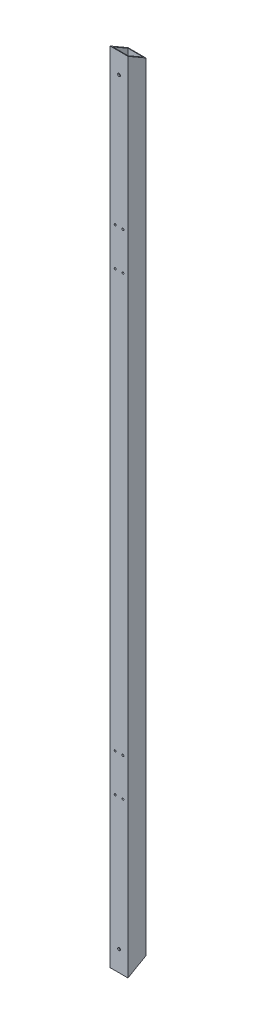
ISO-10303-21;
HEADER;
FILE_DESCRIPTION(('STEP AP214'),'2;1');
FILE_NAME('part.step','',(''),(''),'','','');
FILE_SCHEMA(('AUTOMOTIVE_DESIGN { 1 0 10303 214 1 1 1 1 }'));
ENDSEC;
DATA;
#1=APPLICATION_CONTEXT('core data for automotive mechanical design processes');
#2=APPLICATION_PROTOCOL_DEFINITION('international standard','automotive_design',2000,#1);
#3=PRODUCT_CONTEXT('',#1,'mechanical');
#4=PRODUCT('Part','Part','',(#3));
#5=PRODUCT_RELATED_PRODUCT_CATEGORY('part','',(#4));
#6=PRODUCT_DEFINITION_FORMATION('','',#4);
#7=PRODUCT_DEFINITION_CONTEXT('part definition',#1,'design');
#8=PRODUCT_DEFINITION('design','',#6,#7);
#9=PRODUCT_DEFINITION_SHAPE('','',#8);
#10=(LENGTH_UNIT() NAMED_UNIT(*) SI_UNIT(.MILLI.,.METRE.));
#11=(NAMED_UNIT(*) PLANE_ANGLE_UNIT() SI_UNIT($,.RADIAN.));
#12=(NAMED_UNIT(*) SI_UNIT($,.STERADIAN.) SOLID_ANGLE_UNIT());
#13=UNCERTAINTY_MEASURE_WITH_UNIT(LENGTH_MEASURE(1.E-05),#10,'distance_accuracy_value','');
#14=(GEOMETRIC_REPRESENTATION_CONTEXT(3) GLOBAL_UNCERTAINTY_ASSIGNED_CONTEXT((#13)) GLOBAL_UNIT_ASSIGNED_CONTEXT((#10,
#11,#12)) REPRESENTATION_CONTEXT('',''));
#15=CARTESIAN_POINT('',(0.,0.,0.));
#16=DIRECTION('',(0.,0.,1.));
#17=DIRECTION('',(1.,0.,0.));
#18=AXIS2_PLACEMENT_3D('',#15,#16,#17);
#19=CARTESIAN_POINT('',(-19.0500000000003,-990.092,3.175));
#20=DIRECTION('',(0.,0.,-1.));
#21=DIRECTION('',(-1.00000000000001,0.,0.));
#22=AXIS2_PLACEMENT_3D('',#19,#20,#21);
#23=PLANE('',#22);
#24=CARTESIAN_POINT('',(-9.52500000000015,-612.1654,3.175));
#25=DIRECTION('',(0.,0.,-1.));
#26=DIRECTION('',(-1.00000000000001,0.,0.));
#27=AXIS2_PLACEMENT_3D('',#24,#25,#26);
#28=CIRCLE('',#27,2.45744999999999);
#29=CARTESIAN_POINT('',(-11.9824500000002,-612.1654,3.175));
#30=VERTEX_POINT('',#29);
#31=EDGE_CURVE('E760',#30,#30,#28,.T.);
#32=ORIENTED_EDGE('',*,*,#31,.T.);
#33=EDGE_LOOP('',(#32));
#34=FACE_BOUND('',#33,.T.);
#35=CARTESIAN_POINT('',(9.52500000000005,-612.1654,3.17499999999987));
#36=DIRECTION('',(0.,0.,-1.));
#37=DIRECTION('',(-1.00000000000001,0.,0.));
#38=AXIS2_PLACEMENT_3D('',#35,#36,#37);
#39=CIRCLE('',#38,2.45744999999999);
#40=CARTESIAN_POINT('',(7.06755000000004,-612.1654,3.17499999999987));
#41=VERTEX_POINT('',#40);
#42=EDGE_CURVE('E746',#41,#41,#39,.T.);
#43=ORIENTED_EDGE('',*,*,#42,.T.);
#44=EDGE_LOOP('',(#43));
#45=FACE_BOUND('',#44,.T.);
#46=CARTESIAN_POINT('',(-9.52500000000009,-518.1346,3.175));
#47=DIRECTION('',(0.,0.,-1.));
#48=DIRECTION('',(-1.00000000000001,0.,0.));
#49=AXIS2_PLACEMENT_3D('',#46,#47,#48);
#50=CIRCLE('',#49,2.45744999999999);
#51=CARTESIAN_POINT('',(-11.9824500000001,-518.1346,3.175));
#52=VERTEX_POINT('',#51);
#53=EDGE_CURVE('E732',#52,#52,#50,.T.);
#54=ORIENTED_EDGE('',*,*,#53,.T.);
#55=EDGE_LOOP('',(#54));
#56=FACE_BOUND('',#55,.T.);
#57=CARTESIAN_POINT('',(9.52500000000005,-518.1346,3.17499999999987));
#58=DIRECTION('',(0.,0.,-1.));
#59=DIRECTION('',(-1.00000000000001,0.,0.));
#60=AXIS2_PLACEMENT_3D('',#57,#58,#59);
#61=CIRCLE('',#60,2.45744999999999);
#62=CARTESIAN_POINT('',(7.06755000000004,-518.1346,3.17499999999987));
#63=VERTEX_POINT('',#62);
#64=EDGE_CURVE('E718',#63,#63,#61,.T.);
#65=ORIENTED_EDGE('',*,*,#64,.T.);
#66=EDGE_LOOP('',(#65));
#67=FACE_BOUND('',#66,.T.);
#68=CARTESIAN_POINT('',(-9.52500000000009,518.1346,3.175));
#69=DIRECTION('',(0.,0.,-1.));
#70=DIRECTION('',(-1.00000000000001,0.,0.));
#71=AXIS2_PLACEMENT_3D('',#68,#69,#70);
#72=CIRCLE('',#71,2.45744999999999);
#73=CARTESIAN_POINT('',(-11.9824500000001,518.1346,3.175));
#74=VERTEX_POINT('',#73);
#75=EDGE_CURVE('E704',#74,#74,#72,.T.);
#76=ORIENTED_EDGE('',*,*,#75,.T.);
#77=EDGE_LOOP('',(#76));
#78=FACE_BOUND('',#77,.T.);
#79=CARTESIAN_POINT('',(9.52500000000002,518.1346,3.17499999999987));
#80=DIRECTION('',(0.,0.,-1.));
#81=DIRECTION('',(-1.00000000000001,0.,0.));
#82=AXIS2_PLACEMENT_3D('',#79,#80,#81);
#83=CIRCLE('',#82,2.45744999999999);
#84=CARTESIAN_POINT('',(7.06755000000001,518.1346,3.17499999999987));
#85=VERTEX_POINT('',#84);
#86=EDGE_CURVE('E690',#85,#85,#83,.T.);
#87=ORIENTED_EDGE('',*,*,#86,.T.);
#88=EDGE_LOOP('',(#87));
#89=FACE_BOUND('',#88,.T.);
#90=CARTESIAN_POINT('',(-9.52500000000015,612.1654,3.175));
#91=DIRECTION('',(0.,0.,-1.));
#92=DIRECTION('',(-1.00000000000001,0.,0.));
#93=AXIS2_PLACEMENT_3D('',#90,#91,#92);
#94=CIRCLE('',#93,2.45744999999999);
#95=CARTESIAN_POINT('',(-11.9824500000002,612.1654,3.175));
#96=VERTEX_POINT('',#95);
#97=EDGE_CURVE('E676',#96,#96,#94,.T.);
#98=ORIENTED_EDGE('',*,*,#97,.T.);
#99=EDGE_LOOP('',(#98));
#100=FACE_BOUND('',#99,.T.);
#101=CARTESIAN_POINT('',(9.52500000000002,612.1654,3.17499999999987));
#102=DIRECTION('',(0.,0.,-1.));
#103=DIRECTION('',(-1.00000000000001,0.,0.));
#104=AXIS2_PLACEMENT_3D('',#101,#102,#103);
#105=CIRCLE('',#104,2.45744999999999);
#106=CARTESIAN_POINT('',(7.06755000000001,612.1654,3.17499999999987));
#107=VERTEX_POINT('',#106);
#108=EDGE_CURVE('E662',#107,#107,#105,.T.);
#109=ORIENTED_EDGE('',*,*,#108,.T.);
#110=EDGE_LOOP('',(#109));
#111=FACE_BOUND('',#110,.T.);
#112=CARTESIAN_POINT('',(-3.60822483003176E-13,939.037999999999,3.175));
#113=DIRECTION('',(0.,0.,-1.));
#114=DIRECTION('',(-1.00000000000001,0.,0.));
#115=AXIS2_PLACEMENT_3D('',#112,#113,#114);
#116=CIRCLE('',#115,3.37343749999996);
#117=CARTESIAN_POINT('',(-3.37343750000035,939.037999999999,3.175));
#118=VERTEX_POINT('',#117);
#119=EDGE_CURVE('E205',#118,#118,#116,.T.);
#120=ORIENTED_EDGE('',*,*,#119,.T.);
#121=EDGE_LOOP('',(#120));
#122=FACE_BOUND('',#121,.T.);
#123=CARTESIAN_POINT('',(-3.60822483003176E-13,-939.038,3.175));
#124=DIRECTION('',(0.,0.,-1.));
#125=DIRECTION('',(-1.00000000000001,0.,0.));
#126=AXIS2_PLACEMENT_3D('',#123,#124,#125);
#127=CIRCLE('',#126,3.37343749999996);
#128=CARTESIAN_POINT('',(-3.37343750000035,-939.038,3.175));
#129=VERTEX_POINT('',#128);
#130=EDGE_CURVE('E225',#129,#129,#127,.T.);
#131=ORIENTED_EDGE('',*,*,#130,.T.);
#132=EDGE_LOOP('',(#131));
#133=FACE_BOUND('',#132,.T.);
#134=DIRECTION('',(0.,1.,0.));
#135=VECTOR('',#134,1.);
#136=CARTESIAN_POINT('',(19.05,-990.092,3.175));
#137=LINE('',#136,#135);
#138=CARTESIAN_POINT('',(19.05,-966.261867639198,3.175));
#139=VERTEX_POINT('',#138);
#140=CARTESIAN_POINT('',(19.0500000000001,966.261867639197,3.175));
#141=VERTEX_POINT('',#140);
#142=EDGE_CURVE('E164',#139,#141,#137,.T.);
#143=ORIENTED_EDGE('',*,*,#142,.T.);
#144=DIRECTION('',(-1.00000000000001,0.,0.));
#145=VECTOR('',#144,1.);
#146=CARTESIAN_POINT('',(-19.0500000000004,966.261867639197,3.175));
#147=LINE('',#146,#145);
#148=CARTESIAN_POINT('',(-19.0500000000002,966.261867639197,3.175));
#149=VERTEX_POINT('',#148);
#150=EDGE_CURVE('E11',#141,#149,#147,.T.);
#151=ORIENTED_EDGE('',*,*,#150,.T.);
#152=DIRECTION('',(0.,1.,0.));
#153=VECTOR('',#152,1.);
#154=CARTESIAN_POINT('',(-19.0500000000003,-990.092,3.175));
#155=LINE('',#154,#153);
#156=CARTESIAN_POINT('',(-19.0500000000003,-966.261867639198,3.175));
#157=VERTEX_POINT('',#156);
#158=EDGE_CURVE('E166',#157,#149,#155,.T.);
#159=ORIENTED_EDGE('',*,*,#158,.F.);
#160=DIRECTION('',(1.00000000000001,0.,0.));
#161=VECTOR('',#160,1.);
#162=CARTESIAN_POINT('',(-19.0500000000003,-966.261867639198,3.175));
#163=LINE('',#162,#161);
#164=EDGE_CURVE('E53',#157,#139,#163,.T.);
#165=ORIENTED_EDGE('',*,*,#164,.T.);
#166=EDGE_LOOP('',(#143,#151,#159,#165));
#167=FACE_BOUND('',#166,.T.);
#168=ADVANCED_FACE('F44',(#34,#45,#56,#67,#78,#89,#100,#111,#122,#133,#167),#23,.F.);
#169=CARTESIAN_POINT('',(-19.0500000000003,-990.092,3.175));
#170=DIRECTION('',(-1.00000000000001,0.,0.));
#171=DIRECTION('',(0.,0.,1.));
#172=AXIS2_PLACEMENT_3D('',#169,#170,#171);
#173=PLANE('',#172);
#174=ORIENTED_EDGE('',*,*,#158,.T.);
#175=DIRECTION('',(0.,0.500000000000007,0.866025403784435));
#176=VECTOR('',#175,1.);
#177=CARTESIAN_POINT('',(-19.0500000000003,477.173400729384,-843.95107408375));
#178=LINE('',#177,#176);
#179=CARTESIAN_POINT('',(-19.0500000000002,988.258912895322,41.2749999999999));
#180=VERTEX_POINT('',#179);
#181=EDGE_CURVE('E238',#149,#180,#178,.T.);
#182=ORIENTED_EDGE('',*,*,#181,.T.);
#183=DIRECTION('',(0.,1.,0.));
#184=VECTOR('',#183,1.);
#185=CARTESIAN_POINT('',(-19.0500000000002,-990.092,41.275));
#186=LINE('',#185,#184);
#187=CARTESIAN_POINT('',(-19.0500000000002,-988.258912895323,41.275));
#188=VERTEX_POINT('',#187);
#189=EDGE_CURVE('E182',#188,#180,#186,.T.);
#190=ORIENTED_EDGE('',*,*,#189,.F.);
#191=DIRECTION('',(0.,0.500000000000004,-0.866025403784437));
#192=VECTOR('',#191,1.);
#193=CARTESIAN_POINT('',(-19.0500000000001,-972.219400729399,13.4937500000002));
#194=LINE('',#193,#192);
#195=EDGE_CURVE('E216',#188,#157,#194,.T.);
#196=ORIENTED_EDGE('',*,*,#195,.T.);
#197=EDGE_LOOP('',(#174,#182,#190,#196));
#198=FACE_BOUND('',#197,.T.);
#199=ADVANCED_FACE('F278',(#198),#173,.F.);
#200=CARTESIAN_POINT('',(-19.0500000000002,-990.092,41.275));
#201=DIRECTION('',(0.,0.,1.));
#202=DIRECTION('',(1.00000000000001,0.,0.));
#203=AXIS2_PLACEMENT_3D('',#200,#201,#202);
#204=PLANE('',#203);
#205=CARTESIAN_POINT('',(-9.5250000000002,-612.1654,41.275));
#206=DIRECTION('',(0.,0.,1.));
#207=DIRECTION('',(1.00000000000001,0.,0.));
#208=AXIS2_PLACEMENT_3D('',#205,#206,#207);
#209=CIRCLE('',#208,2.45744999999999);
#210=CARTESIAN_POINT('',(-7.06755000000019,-612.1654,41.275));
#211=VERTEX_POINT('',#210);
#212=EDGE_CURVE('E619',#211,#211,#209,.T.);
#213=ORIENTED_EDGE('',*,*,#212,.T.);
#214=EDGE_LOOP('',(#213));
#215=FACE_BOUND('',#214,.T.);
#216=CARTESIAN_POINT('',(9.52500000000005,-612.1654,41.2749999999999));
#217=DIRECTION('',(0.,0.,1.));
#218=DIRECTION('',(1.00000000000001,0.,0.));
#219=AXIS2_PLACEMENT_3D('',#216,#217,#218);
#220=CIRCLE('',#219,2.45744999999999);
#221=CARTESIAN_POINT('',(11.9824500000001,-612.1654,41.2749999999999));
#222=VERTEX_POINT('',#221);
#223=EDGE_CURVE('E623',#222,#222,#220,.T.);
#224=ORIENTED_EDGE('',*,*,#223,.T.);
#225=EDGE_LOOP('',(#224));
#226=FACE_BOUND('',#225,.T.);
#227=CARTESIAN_POINT('',(-9.52500000000014,-518.1346,41.275));
#228=DIRECTION('',(0.,0.,1.));
#229=DIRECTION('',(1.00000000000001,0.,0.));
#230=AXIS2_PLACEMENT_3D('',#227,#228,#229);
#231=CIRCLE('',#230,2.45744999999999);
#232=CARTESIAN_POINT('',(-7.06755000000013,-518.1346,41.275));
#233=VERTEX_POINT('',#232);
#234=EDGE_CURVE('E627',#233,#233,#231,.T.);
#235=ORIENTED_EDGE('',*,*,#234,.T.);
#236=EDGE_LOOP('',(#235));
#237=FACE_BOUND('',#236,.T.);
#238=CARTESIAN_POINT('',(9.52500000000005,-518.1346,41.2749999999999));
#239=DIRECTION('',(0.,0.,1.));
#240=DIRECTION('',(1.00000000000001,0.,0.));
#241=AXIS2_PLACEMENT_3D('',#238,#239,#240);
#242=CIRCLE('',#241,2.45744999999999);
#243=CARTESIAN_POINT('',(11.9824500000001,-518.1346,41.2749999999999));
#244=VERTEX_POINT('',#243);
#245=EDGE_CURVE('E631',#244,#244,#242,.T.);
#246=ORIENTED_EDGE('',*,*,#245,.T.);
#247=EDGE_LOOP('',(#246));
#248=FACE_BOUND('',#247,.T.);
#249=CARTESIAN_POINT('',(-9.52500000000015,518.1346,41.275));
#250=DIRECTION('',(0.,0.,1.));
#251=DIRECTION('',(1.00000000000001,0.,0.));
#252=AXIS2_PLACEMENT_3D('',#249,#250,#251);
#253=CIRCLE('',#252,2.45744999999999);
#254=CARTESIAN_POINT('',(-7.06755000000014,518.1346,41.275));
#255=VERTEX_POINT('',#254);
#256=EDGE_CURVE('E635',#255,#255,#253,.T.);
#257=ORIENTED_EDGE('',*,*,#256,.T.);
#258=EDGE_LOOP('',(#257));
#259=FACE_BOUND('',#258,.T.);
#260=CARTESIAN_POINT('',(9.52500000000002,518.1346,41.2749999999999));
#261=DIRECTION('',(0.,0.,1.));
#262=DIRECTION('',(1.00000000000001,0.,0.));
#263=AXIS2_PLACEMENT_3D('',#260,#261,#262);
#264=CIRCLE('',#263,2.45744999999999);
#265=CARTESIAN_POINT('',(11.98245,518.1346,41.2749999999999));
#266=VERTEX_POINT('',#265);
#267=EDGE_CURVE('E639',#266,#266,#264,.T.);
#268=ORIENTED_EDGE('',*,*,#267,.T.);
#269=EDGE_LOOP('',(#268));
#270=FACE_BOUND('',#269,.T.);
#271=CARTESIAN_POINT('',(-9.5250000000002,612.1654,41.275));
#272=DIRECTION('',(0.,0.,1.));
#273=DIRECTION('',(1.00000000000001,0.,0.));
#274=AXIS2_PLACEMENT_3D('',#271,#272,#273);
#275=CIRCLE('',#274,2.45744999999999);
#276=CARTESIAN_POINT('',(-7.06755000000019,612.1654,41.275));
#277=VERTEX_POINT('',#276);
#278=EDGE_CURVE('E643',#277,#277,#275,.T.);
#279=ORIENTED_EDGE('',*,*,#278,.T.);
#280=EDGE_LOOP('',(#279));
#281=FACE_BOUND('',#280,.T.);
#282=CARTESIAN_POINT('',(9.52500000000002,612.1654,41.2749999999999));
#283=DIRECTION('',(0.,0.,1.));
#284=DIRECTION('',(1.00000000000001,0.,0.));
#285=AXIS2_PLACEMENT_3D('',#282,#283,#284);
#286=CIRCLE('',#285,2.45744999999999);
#287=CARTESIAN_POINT('',(11.98245,612.1654,41.2749999999999));
#288=VERTEX_POINT('',#287);
#289=EDGE_CURVE('E647',#288,#288,#286,.T.);
#290=ORIENTED_EDGE('',*,*,#289,.T.);
#291=EDGE_LOOP('',(#290));
#292=FACE_BOUND('',#291,.T.);
#293=CARTESIAN_POINT('',(-3.60822483003176E-13,939.037999999999,41.275));
#294=DIRECTION('',(0.,0.,1.));
#295=DIRECTION('',(1.00000000000001,0.,0.));
#296=AXIS2_PLACEMENT_3D('',#293,#294,#295);
#297=CIRCLE('',#296,3.37343749999996);
#298=CARTESIAN_POINT('',(3.37343749999963,939.037999999999,41.275));
#299=VERTEX_POINT('',#298);
#300=EDGE_CURVE('E210',#299,#299,#297,.T.);
#301=ORIENTED_EDGE('',*,*,#300,.T.);
#302=EDGE_LOOP('',(#301));
#303=FACE_BOUND('',#302,.T.);
#304=CARTESIAN_POINT('',(-3.60822483003176E-13,-939.038,41.275));
#305=DIRECTION('',(0.,0.,1.));
#306=DIRECTION('',(1.00000000000001,0.,0.));
#307=AXIS2_PLACEMENT_3D('',#304,#305,#306);
#308=CIRCLE('',#307,3.37343749999996);
#309=CARTESIAN_POINT('',(3.37343749999963,-939.038,41.275));
#310=VERTEX_POINT('',#309);
#311=EDGE_CURVE('E199',#310,#310,#308,.T.);
#312=ORIENTED_EDGE('',*,*,#311,.T.);
#313=EDGE_LOOP('',(#312));
#314=FACE_BOUND('',#313,.T.);
#315=ORIENTED_EDGE('',*,*,#189,.T.);
#316=DIRECTION('',(1.00000000000001,0.,0.));
#317=VECTOR('',#316,1.);
#318=CARTESIAN_POINT('',(-19.0500000000004,988.258912895323,41.275));
#319=LINE('',#318,#317);
#320=CARTESIAN_POINT('',(19.0500000000001,988.258912895323,41.275));
#321=VERTEX_POINT('',#320);
#322=EDGE_CURVE('E185',#180,#321,#319,.T.);
#323=ORIENTED_EDGE('',*,*,#322,.T.);
#324=DIRECTION('',(0.,1.,0.));
#325=VECTOR('',#324,1.);
#326=CARTESIAN_POINT('',(19.0500000000001,-990.092,41.275));
#327=LINE('',#326,#325);
#328=CARTESIAN_POINT('',(19.0500000000001,-988.258912895323,41.275));
#329=VERTEX_POINT('',#328);
#330=EDGE_CURVE('E154',#329,#321,#327,.T.);
#331=ORIENTED_EDGE('',*,*,#330,.F.);
#332=DIRECTION('',(-1.00000000000001,0.,0.));
#333=VECTOR('',#332,1.);
#334=CARTESIAN_POINT('',(-19.0500000000002,-988.258912895323,41.275));
#335=LINE('',#334,#333);
#336=EDGE_CURVE('E266',#329,#188,#335,.T.);
#337=ORIENTED_EDGE('',*,*,#336,.T.);
#338=EDGE_LOOP('',(#315,#323,#331,#337));
#339=FACE_BOUND('',#338,.T.);
#340=ADVANCED_FACE('F276',(#215,#226,#237,#248,#259,#270,#281,#292,#303,#314,#339),#204,.F.);
#341=CARTESIAN_POINT('',(19.05,-990.092,3.175));
#342=DIRECTION('',(1.00000000000001,0.,0.));
#343=DIRECTION('',(0.,0.,-1.));
#344=AXIS2_PLACEMENT_3D('',#341,#342,#343);
#345=PLANE('',#344);
#346=ORIENTED_EDGE('',*,*,#330,.T.);
#347=DIRECTION('',(0.,-0.500000000000007,-0.866025403784435));
#348=VECTOR('',#347,1.);
#349=CARTESIAN_POINT('',(19.0499999999998,477.173400729384,-843.95107408375));
#350=LINE('',#349,#348);
#351=EDGE_CURVE('E176',#321,#141,#350,.T.);
#352=ORIENTED_EDGE('',*,*,#351,.T.);
#353=ORIENTED_EDGE('',*,*,#142,.F.);
#354=DIRECTION('',(0.,-0.500000000000004,0.866025403784437));
#355=VECTOR('',#354,1.);
#356=CARTESIAN_POINT('',(19.0500000000001,-972.219400729399,13.4937500000002));
#357=LINE('',#356,#355);
#358=EDGE_CURVE('E174',#139,#329,#357,.T.);
#359=ORIENTED_EDGE('',*,*,#358,.T.);
#360=EDGE_LOOP('',(#346,#352,#353,#359));
#361=FACE_BOUND('',#360,.T.);
#362=ADVANCED_FACE('F173',(#361),#345,.F.);
#363=CARTESIAN_POINT('',(-22.2250000000002,-990.092,44.45));
#364=DIRECTION('',(0.,0.866025403784437,0.500000000000004));
#365=DIRECTION('',(0.,-0.500000000000004,0.866025403784437));
#366=AXIS2_PLACEMENT_3D('',#363,#364,#365);
#367=PLANE('',#366);
#368=DIRECTION('',(0.,-0.500000000000004,0.866025403784436));
#369=VECTOR('',#368,1.);
#370=CARTESIAN_POINT('',(22.2250000000003,-990.092,44.45));
#371=LINE('',#370,#369);
#372=CARTESIAN_POINT('',(22.2250000000002,-964.428780534521,0.));
#373=VERTEX_POINT('',#372);
#374=CARTESIAN_POINT('',(22.2250000000003,-990.092,44.45));
#375=VERTEX_POINT('',#374);
#376=EDGE_CURVE('E209',#373,#375,#371,.T.);
#377=ORIENTED_EDGE('',*,*,#376,.T.);
#378=DIRECTION('',(1.00000000000001,0.,0.));
#379=VECTOR('',#378,1.);
#380=CARTESIAN_POINT('',(-22.225,-990.092,44.45));
#381=LINE('',#380,#379);
#382=CARTESIAN_POINT('',(-22.2250000000002,-990.092,44.45));
#383=VERTEX_POINT('',#382);
#384=EDGE_CURVE('E140',#383,#375,#381,.T.);
#385=ORIENTED_EDGE('',*,*,#384,.F.);
#386=DIRECTION('',(0.,-0.500000000000004,0.866025403784436));
#387=VECTOR('',#386,1.);
#388=CARTESIAN_POINT('',(-22.2250000000002,-990.092,44.45));
#389=LINE('',#388,#387);
#390=CARTESIAN_POINT('',(-22.225,-964.428780534521,0.));
#391=VERTEX_POINT('',#390);
#392=EDGE_CURVE('E60',#391,#383,#389,.T.);
#393=ORIENTED_EDGE('',*,*,#392,.F.);
#394=DIRECTION('',(1.00000000000001,0.,0.));
#395=VECTOR('',#394,1.);
#396=CARTESIAN_POINT('',(-22.2250000000002,-964.428780534521,0.));
#397=LINE('',#396,#395);
#398=EDGE_CURVE('E252',#391,#373,#397,.T.);
#399=ORIENTED_EDGE('',*,*,#398,.T.);
#400=EDGE_LOOP('',(#377,#385,#393,#399));
#401=FACE_BOUND('',#400,.T.);
#402=ORIENTED_EDGE('',*,*,#164,.F.);
#403=ORIENTED_EDGE('',*,*,#195,.F.);
#404=ORIENTED_EDGE('',*,*,#336,.F.);
#405=ORIENTED_EDGE('',*,*,#358,.F.);
#406=EDGE_LOOP('',(#402,#403,#404,#405));
#407=FACE_BOUND('',#406,.T.);
#408=ADVANCED_FACE('F280',(#401,#407),#367,.F.);
#409=CARTESIAN_POINT('',(-22.2250000000005,990.092,44.45));
#410=DIRECTION('',(0.,-0.866025403784435,0.500000000000007));
#411=DIRECTION('',(0.,-0.500000000000007,-0.866025403784435));
#412=AXIS2_PLACEMENT_3D('',#409,#410,#411);
#413=PLANE('',#412);
#414=DIRECTION('',(0.,-0.500000000000007,-0.866025403784435));
#415=VECTOR('',#414,1.);
#416=CARTESIAN_POINT('',(22.225,990.092,44.45));
#417=LINE('',#416,#415);
#418=CARTESIAN_POINT('',(22.225,990.092,44.45));
#419=VERTEX_POINT('',#418);
#420=CARTESIAN_POINT('',(22.2250000000001,964.42878053452,0.));
#421=VERTEX_POINT('',#420);
#422=EDGE_CURVE('E71',#419,#421,#417,.T.);
#423=ORIENTED_EDGE('',*,*,#422,.T.);
#424=DIRECTION('',(1.00000000000001,0.,0.));
#425=VECTOR('',#424,1.);
#426=CARTESIAN_POINT('',(-22.2250000000004,964.42878053452,0.));
#427=LINE('',#426,#425);
#428=CARTESIAN_POINT('',(-22.2250000000004,964.42878053452,0.));
#429=VERTEX_POINT('',#428);
#430=EDGE_CURVE('E121',#429,#421,#427,.T.);
#431=ORIENTED_EDGE('',*,*,#430,.F.);
#432=DIRECTION('',(0.,-0.500000000000007,-0.866025403784435));
#433=VECTOR('',#432,1.);
#434=CARTESIAN_POINT('',(-22.2250000000005,990.092,44.45));
#435=LINE('',#434,#433);
#436=CARTESIAN_POINT('',(-22.2250000000005,990.092,44.45));
#437=VERTEX_POINT('',#436);
#438=EDGE_CURVE('E116',#437,#429,#435,.T.);
#439=ORIENTED_EDGE('',*,*,#438,.F.);
#440=DIRECTION('',(-1.00000000000001,0.,0.));
#441=VECTOR('',#440,1.);
#442=CARTESIAN_POINT('',(-22.2250000000002,990.092,44.45));
#443=LINE('',#442,#441);
#444=EDGE_CURVE('E120',#419,#437,#443,.T.);
#445=ORIENTED_EDGE('',*,*,#444,.F.);
#446=EDGE_LOOP('',(#423,#431,#439,#445));
#447=FACE_BOUND('',#446,.T.);
#448=ORIENTED_EDGE('',*,*,#322,.F.);
#449=ORIENTED_EDGE('',*,*,#181,.F.);
#450=ORIENTED_EDGE('',*,*,#150,.F.);
#451=ORIENTED_EDGE('',*,*,#351,.F.);
#452=EDGE_LOOP('',(#448,#449,#450,#451));
#453=FACE_BOUND('',#452,.T.);
#454=ADVANCED_FACE('F118',(#447,#453),#413,.F.);
#455=CARTESIAN_POINT('',(22.225,990.092,44.45));
#456=DIRECTION('',(-1.00000000000001,0.,0.));
#457=DIRECTION('',(0.,-1.,0.));
#458=AXIS2_PLACEMENT_3D('',#455,#456,#457);
#459=PLANE('',#458);
#460=DIRECTION('',(0.,1.,0.));
#461=VECTOR('',#460,1.);
#462=CARTESIAN_POINT('',(22.2250000000001,990.092,0.));
#463=LINE('',#462,#461);
#464=EDGE_CURVE('E149',#373,#421,#463,.T.);
#465=ORIENTED_EDGE('',*,*,#464,.T.);
#466=ORIENTED_EDGE('',*,*,#422,.F.);
#467=DIRECTION('',(0.,1.,0.));
#468=VECTOR('',#467,1.);
#469=CARTESIAN_POINT('',(22.225,990.092,44.45));
#470=LINE('',#469,#468);
#471=EDGE_CURVE('E135',#375,#419,#470,.T.);
#472=ORIENTED_EDGE('',*,*,#471,.F.);
#473=ORIENTED_EDGE('',*,*,#376,.F.);
#474=EDGE_LOOP('',(#465,#466,#472,#473));
#475=FACE_BOUND('',#474,.T.);
#476=ADVANCED_FACE('F46',(#475),#459,.F.);
#477=CARTESIAN_POINT('',(-22.2250000000002,990.092,44.45));
#478=DIRECTION('',(1.00000000000001,0.,0.));
#479=DIRECTION('',(0.,1.,0.));
#480=AXIS2_PLACEMENT_3D('',#477,#478,#479);
#481=PLANE('',#480);
#482=DIRECTION('',(0.,-1.,0.));
#483=VECTOR('',#482,1.);
#484=CARTESIAN_POINT('',(-22.2250000000002,990.092,44.45));
#485=LINE('',#484,#483);
#486=EDGE_CURVE('E133',#437,#383,#485,.T.);
#487=ORIENTED_EDGE('',*,*,#486,.F.);
#488=ORIENTED_EDGE('',*,*,#438,.T.);
#489=DIRECTION('',(0.,-1.,0.));
#490=VECTOR('',#489,1.);
#491=CARTESIAN_POINT('',(-22.2250000000001,990.092,0.));
#492=LINE('',#491,#490);
#493=EDGE_CURVE('E153',#429,#391,#492,.T.);
#494=ORIENTED_EDGE('',*,*,#493,.T.);
#495=ORIENTED_EDGE('',*,*,#392,.T.);
#496=EDGE_LOOP('',(#487,#488,#494,#495));
#497=FACE_BOUND('',#496,.T.);
#498=ADVANCED_FACE('F138',(#497),#481,.F.);
#499=CARTESIAN_POINT('',(0.,0.,44.45));
#500=DIRECTION('',(0.,0.,1.));
#501=DIRECTION('',(1.00000000000001,0.,0.));
#502=AXIS2_PLACEMENT_3D('',#499,#500,#501);
#503=PLANE('',#502);
#504=CARTESIAN_POINT('',(-9.52500000000014,-612.1654,44.45));
#505=DIRECTION('',(0.,0.,1.));
#506=DIRECTION('',(1.00000000000001,0.,0.));
#507=AXIS2_PLACEMENT_3D('',#504,#505,#506);
#508=CIRCLE('',#507,2.45744999999999);
#509=CARTESIAN_POINT('',(-7.06755000000014,-612.1654,44.45));
#510=VERTEX_POINT('',#509);
#511=EDGE_CURVE('E769',#510,#510,#508,.T.);
#512=ORIENTED_EDGE('',*,*,#511,.F.);
#513=EDGE_LOOP('',(#512));
#514=FACE_BOUND('',#513,.T.);
#515=CARTESIAN_POINT('',(9.52500000000005,-612.1654,44.4499999999999));
#516=DIRECTION('',(0.,0.,1.));
#517=DIRECTION('',(1.00000000000001,0.,0.));
#518=AXIS2_PLACEMENT_3D('',#515,#516,#517);
#519=CIRCLE('',#518,2.45744999999999);
#520=CARTESIAN_POINT('',(11.9824500000001,-612.1654,44.4499999999999));
#521=VERTEX_POINT('',#520);
#522=EDGE_CURVE('E756',#521,#521,#519,.T.);
#523=ORIENTED_EDGE('',*,*,#522,.F.);
#524=EDGE_LOOP('',(#523));
#525=FACE_BOUND('',#524,.T.);
#526=CARTESIAN_POINT('',(-9.52500000000009,-518.1346,44.45));
#527=DIRECTION('',(0.,0.,1.));
#528=DIRECTION('',(1.00000000000001,0.,0.));
#529=AXIS2_PLACEMENT_3D('',#526,#527,#528);
#530=CIRCLE('',#529,2.45744999999999);
#531=CARTESIAN_POINT('',(-7.06755000000008,-518.1346,44.45));
#532=VERTEX_POINT('',#531);
#533=EDGE_CURVE('E742',#532,#532,#530,.T.);
#534=ORIENTED_EDGE('',*,*,#533,.F.);
#535=EDGE_LOOP('',(#534));
#536=FACE_BOUND('',#535,.T.);
#537=CARTESIAN_POINT('',(9.52500000000005,-518.1346,44.4499999999999));
#538=DIRECTION('',(0.,0.,1.));
#539=DIRECTION('',(1.00000000000001,0.,0.));
#540=AXIS2_PLACEMENT_3D('',#537,#538,#539);
#541=CIRCLE('',#540,2.45744999999999);
#542=CARTESIAN_POINT('',(11.9824500000001,-518.1346,44.4499999999999));
#543=VERTEX_POINT('',#542);
#544=EDGE_CURVE('E728',#543,#543,#541,.T.);
#545=ORIENTED_EDGE('',*,*,#544,.F.);
#546=EDGE_LOOP('',(#545));
#547=FACE_BOUND('',#546,.T.);
#548=CARTESIAN_POINT('',(-9.52500000000009,518.1346,44.45));
#549=DIRECTION('',(0.,0.,1.));
#550=DIRECTION('',(1.00000000000001,0.,0.));
#551=AXIS2_PLACEMENT_3D('',#548,#549,#550);
#552=CIRCLE('',#551,2.45744999999999);
#553=CARTESIAN_POINT('',(-7.06755000000008,518.1346,44.45));
#554=VERTEX_POINT('',#553);
#555=EDGE_CURVE('E714',#554,#554,#552,.T.);
#556=ORIENTED_EDGE('',*,*,#555,.F.);
#557=EDGE_LOOP('',(#556));
#558=FACE_BOUND('',#557,.T.);
#559=CARTESIAN_POINT('',(9.52500000000002,518.1346,44.4499999999999));
#560=DIRECTION('',(0.,0.,1.));
#561=DIRECTION('',(1.00000000000001,0.,0.));
#562=AXIS2_PLACEMENT_3D('',#559,#560,#561);
#563=CIRCLE('',#562,2.45744999999999);
#564=CARTESIAN_POINT('',(11.98245,518.1346,44.4499999999999));
#565=VERTEX_POINT('',#564);
#566=EDGE_CURVE('E700',#565,#565,#563,.T.);
#567=ORIENTED_EDGE('',*,*,#566,.F.);
#568=EDGE_LOOP('',(#567));
#569=FACE_BOUND('',#568,.T.);
#570=CARTESIAN_POINT('',(-9.52500000000014,612.1654,44.45));
#571=DIRECTION('',(0.,0.,1.));
#572=DIRECTION('',(1.00000000000001,0.,0.));
#573=AXIS2_PLACEMENT_3D('',#570,#571,#572);
#574=CIRCLE('',#573,2.45744999999999);
#575=CARTESIAN_POINT('',(-7.06755000000014,612.1654,44.45));
#576=VERTEX_POINT('',#575);
#577=EDGE_CURVE('E686',#576,#576,#574,.T.);
#578=ORIENTED_EDGE('',*,*,#577,.F.);
#579=EDGE_LOOP('',(#578));
#580=FACE_BOUND('',#579,.T.);
#581=CARTESIAN_POINT('',(9.52500000000002,612.1654,44.4499999999999));
#582=DIRECTION('',(0.,0.,1.));
#583=DIRECTION('',(1.00000000000001,0.,0.));
#584=AXIS2_PLACEMENT_3D('',#581,#582,#583);
#585=CIRCLE('',#584,2.45744999999999);
#586=CARTESIAN_POINT('',(11.98245,612.1654,44.4499999999999));
#587=VERTEX_POINT('',#586);
#588=EDGE_CURVE('E673',#587,#587,#585,.T.);
#589=ORIENTED_EDGE('',*,*,#588,.F.);
#590=EDGE_LOOP('',(#589));
#591=FACE_BOUND('',#590,.T.);
#592=CARTESIAN_POINT('',(-3.60822483003176E-13,939.037999999999,44.45));
#593=DIRECTION('',(0.,0.,1.));
#594=DIRECTION('',(1.00000000000001,0.,0.));
#595=AXIS2_PLACEMENT_3D('',#592,#593,#594);
#596=CIRCLE('',#595,3.37343749999996);
#597=CARTESIAN_POINT('',(3.37343749999963,939.037999999999,44.45));
#598=VERTEX_POINT('',#597);
#599=EDGE_CURVE('E200',#598,#598,#596,.T.);
#600=ORIENTED_EDGE('',*,*,#599,.F.);
#601=EDGE_LOOP('',(#600));
#602=FACE_BOUND('',#601,.T.);
#603=CARTESIAN_POINT('',(-3.60822483003176E-13,-939.038,44.45));
#604=DIRECTION('',(0.,0.,1.));
#605=DIRECTION('',(1.00000000000001,0.,0.));
#606=AXIS2_PLACEMENT_3D('',#603,#604,#605);
#607=CIRCLE('',#606,3.37343749999996);
#608=CARTESIAN_POINT('',(3.37343749999963,-939.038,44.45));
#609=VERTEX_POINT('',#608);
#610=EDGE_CURVE('E658',#609,#609,#607,.T.);
#611=ORIENTED_EDGE('',*,*,#610,.F.);
#612=EDGE_LOOP('',(#611));
#613=FACE_BOUND('',#612,.T.);
#614=ORIENTED_EDGE('',*,*,#471,.T.);
#615=ORIENTED_EDGE('',*,*,#444,.T.);
#616=ORIENTED_EDGE('',*,*,#486,.T.);
#617=ORIENTED_EDGE('',*,*,#384,.T.);
#618=EDGE_LOOP('',(#614,#615,#616,#617));
#619=FACE_BOUND('',#618,.T.);
#620=ADVANCED_FACE('F131',(#514,#525,#536,#547,#558,#569,#580,#591,#602,#613,#619),#503,.T.);
#621=CARTESIAN_POINT('',(0.,0.,0.));
#622=DIRECTION('',(0.,0.,1.));
#623=DIRECTION('',(1.00000000000001,0.,0.));
#624=AXIS2_PLACEMENT_3D('',#621,#622,#623);
#625=PLANE('',#624);
#626=CARTESIAN_POINT('',(-9.52500000000021,-612.1654,0.));
#627=DIRECTION('',(0.,0.,1.));
#628=DIRECTION('',(1.00000000000001,0.,0.));
#629=AXIS2_PLACEMENT_3D('',#626,#627,#628);
#630=CIRCLE('',#629,2.45744999999999);
#631=CARTESIAN_POINT('',(-7.0675500000002,-612.1654,0.));
#632=VERTEX_POINT('',#631);
#633=EDGE_CURVE('E765',#632,#632,#630,.T.);
#634=ORIENTED_EDGE('',*,*,#633,.T.);
#635=EDGE_LOOP('',(#634));
#636=FACE_BOUND('',#635,.T.);
#637=CARTESIAN_POINT('',(9.52500000000005,-612.1654,-1.2490009027033E-13));
#638=DIRECTION('',(0.,0.,1.));
#639=DIRECTION('',(1.00000000000001,0.,0.));
#640=AXIS2_PLACEMENT_3D('',#637,#638,#639);
#641=CIRCLE('',#640,2.45744999999999);
#642=CARTESIAN_POINT('',(11.9824500000001,-612.1654,-1.2490009027033E-13));
#643=VERTEX_POINT('',#642);
#644=EDGE_CURVE('E752',#643,#643,#641,.T.);
#645=ORIENTED_EDGE('',*,*,#644,.T.);
#646=EDGE_LOOP('',(#645));
#647=FACE_BOUND('',#646,.T.);
#648=CARTESIAN_POINT('',(-9.52500000000015,-518.1346,0.));
#649=DIRECTION('',(0.,0.,1.));
#650=DIRECTION('',(1.00000000000001,0.,0.));
#651=AXIS2_PLACEMENT_3D('',#648,#649,#650);
#652=CIRCLE('',#651,2.45744999999999);
#653=CARTESIAN_POINT('',(-7.06755000000014,-518.1346,0.));
#654=VERTEX_POINT('',#653);
#655=EDGE_CURVE('E738',#654,#654,#652,.T.);
#656=ORIENTED_EDGE('',*,*,#655,.T.);
#657=EDGE_LOOP('',(#656));
#658=FACE_BOUND('',#657,.T.);
#659=CARTESIAN_POINT('',(9.52500000000005,-518.1346,-1.2490009027033E-13));
#660=DIRECTION('',(0.,0.,1.));
#661=DIRECTION('',(1.00000000000001,0.,0.));
#662=AXIS2_PLACEMENT_3D('',#659,#660,#661);
#663=CIRCLE('',#662,2.45744999999999);
#664=CARTESIAN_POINT('',(11.9824500000001,-518.1346,-1.2490009027033E-13));
#665=VERTEX_POINT('',#664);
#666=EDGE_CURVE('E724',#665,#665,#663,.T.);
#667=ORIENTED_EDGE('',*,*,#666,.T.);
#668=EDGE_LOOP('',(#667));
#669=FACE_BOUND('',#668,.T.);
#670=CARTESIAN_POINT('',(-9.52500000000014,518.1346,0.));
#671=DIRECTION('',(0.,0.,1.));
#672=DIRECTION('',(1.00000000000001,0.,0.));
#673=AXIS2_PLACEMENT_3D('',#670,#671,#672);
#674=CIRCLE('',#673,2.45744999999999);
#675=CARTESIAN_POINT('',(-7.06755000000013,518.1346,0.));
#676=VERTEX_POINT('',#675);
#677=EDGE_CURVE('E710',#676,#676,#674,.T.);
#678=ORIENTED_EDGE('',*,*,#677,.T.);
#679=EDGE_LOOP('',(#678));
#680=FACE_BOUND('',#679,.T.);
#681=CARTESIAN_POINT('',(9.52500000000002,518.1346,-1.2490009027033E-13));
#682=DIRECTION('',(0.,0.,1.));
#683=DIRECTION('',(1.00000000000001,0.,0.));
#684=AXIS2_PLACEMENT_3D('',#681,#682,#683);
#685=CIRCLE('',#684,2.45744999999999);
#686=CARTESIAN_POINT('',(11.98245,518.1346,-1.2490009027033E-13));
#687=VERTEX_POINT('',#686);
#688=EDGE_CURVE('E696',#687,#687,#685,.T.);
#689=ORIENTED_EDGE('',*,*,#688,.T.);
#690=EDGE_LOOP('',(#689));
#691=FACE_BOUND('',#690,.T.);
#692=CARTESIAN_POINT('',(-9.52500000000021,612.1654,0.));
#693=DIRECTION('',(0.,0.,1.));
#694=DIRECTION('',(1.00000000000001,0.,0.));
#695=AXIS2_PLACEMENT_3D('',#692,#693,#694);
#696=CIRCLE('',#695,2.45744999999999);
#697=CARTESIAN_POINT('',(-7.0675500000002,612.1654,0.));
#698=VERTEX_POINT('',#697);
#699=EDGE_CURVE('E682',#698,#698,#696,.T.);
#700=ORIENTED_EDGE('',*,*,#699,.T.);
#701=EDGE_LOOP('',(#700));
#702=FACE_BOUND('',#701,.T.);
#703=CARTESIAN_POINT('',(9.52500000000002,612.1654,-1.2490009027033E-13));
#704=DIRECTION('',(0.,0.,1.));
#705=DIRECTION('',(1.00000000000001,0.,0.));
#706=AXIS2_PLACEMENT_3D('',#703,#704,#705);
#707=CIRCLE('',#706,2.45744999999999);
#708=CARTESIAN_POINT('',(11.98245,612.1654,-1.2490009027033E-13));
#709=VERTEX_POINT('',#708);
#710=EDGE_CURVE('E669',#709,#709,#707,.T.);
#711=ORIENTED_EDGE('',*,*,#710,.T.);
#712=EDGE_LOOP('',(#711));
#713=FACE_BOUND('',#712,.T.);
#714=CARTESIAN_POINT('',(-3.60822483003176E-13,939.037999999999,0.));
#715=DIRECTION('',(0.,0.,1.));
#716=DIRECTION('',(1.00000000000001,0.,0.));
#717=AXIS2_PLACEMENT_3D('',#714,#715,#716);
#718=CIRCLE('',#717,3.37343749999996);
#719=CARTESIAN_POINT('',(3.37343749999963,939.037999999999,0.));
#720=VERTEX_POINT('',#719);
#721=EDGE_CURVE('E195',#720,#720,#718,.T.);
#722=ORIENTED_EDGE('',*,*,#721,.T.);
#723=EDGE_LOOP('',(#722));
#724=FACE_BOUND('',#723,.T.);
#725=CARTESIAN_POINT('',(-3.60822483003176E-13,-939.038,0.));
#726=DIRECTION('',(0.,0.,1.));
#727=DIRECTION('',(1.00000000000001,0.,0.));
#728=AXIS2_PLACEMENT_3D('',#725,#726,#727);
#729=CIRCLE('',#728,3.37343749999996);
#730=CARTESIAN_POINT('',(3.37343749999963,-939.038,0.));
#731=VERTEX_POINT('',#730);
#732=EDGE_CURVE('E231',#731,#731,#729,.T.);
#733=ORIENTED_EDGE('',*,*,#732,.T.);
#734=EDGE_LOOP('',(#733));
#735=FACE_BOUND('',#734,.T.);
#736=ORIENTED_EDGE('',*,*,#493,.F.);
#737=ORIENTED_EDGE('',*,*,#430,.T.);
#738=ORIENTED_EDGE('',*,*,#464,.F.);
#739=ORIENTED_EDGE('',*,*,#398,.F.);
#740=EDGE_LOOP('',(#736,#737,#738,#739));
#741=FACE_BOUND('',#740,.T.);
#742=ADVANCED_FACE('F304',(#636,#647,#658,#669,#680,#691,#702,#713,#724,#735,#741),#625,.F.);
#743=CARTESIAN_POINT('',(-3.60822483003176E-13,-939.038,0.));
#744=DIRECTION('',(0.,0.,1.));
#745=DIRECTION('',(1.00000000000001,0.,0.));
#746=AXIS2_PLACEMENT_3D('',#743,#744,#745);
#747=CYLINDRICAL_SURFACE('',#746,3.37343749999996);
#748=ORIENTED_EDGE('',*,*,#732,.F.);
#749=EDGE_LOOP('',(#748));
#750=FACE_BOUND('',#749,.T.);
#751=ORIENTED_EDGE('',*,*,#130,.F.);
#752=EDGE_LOOP('',(#751));
#753=FACE_BOUND('',#752,.T.);
#754=ADVANCED_FACE('F307',(#750,#753),#747,.F.);
#755=CARTESIAN_POINT('',(-3.60822483003176E-13,939.037999999999,0.));
#756=DIRECTION('',(0.,0.,1.));
#757=DIRECTION('',(1.00000000000001,0.,0.));
#758=AXIS2_PLACEMENT_3D('',#755,#756,#757);
#759=CYLINDRICAL_SURFACE('',#758,3.37343749999996);
#760=ORIENTED_EDGE('',*,*,#721,.F.);
#761=EDGE_LOOP('',(#760));
#762=FACE_BOUND('',#761,.T.);
#763=ORIENTED_EDGE('',*,*,#119,.F.);
#764=EDGE_LOOP('',(#763));
#765=FACE_BOUND('',#764,.T.);
#766=ADVANCED_FACE('F328',(#762,#765),#759,.F.);
#767=ORIENTED_EDGE('',*,*,#610,.T.);
#768=EDGE_LOOP('',(#767));
#769=FACE_BOUND('',#768,.T.);
#770=ORIENTED_EDGE('',*,*,#311,.F.);
#771=EDGE_LOOP('',(#770));
#772=FACE_BOUND('',#771,.T.);
#773=ADVANCED_FACE('F330',(#769,#772),#747,.F.);
#774=ORIENTED_EDGE('',*,*,#599,.T.);
#775=EDGE_LOOP('',(#774));
#776=FACE_BOUND('',#775,.T.);
#777=ORIENTED_EDGE('',*,*,#300,.F.);
#778=EDGE_LOOP('',(#777));
#779=FACE_BOUND('',#778,.T.);
#780=ADVANCED_FACE('F338',(#776,#779),#759,.F.);
#781=CARTESIAN_POINT('',(9.52500000000002,612.1654,44.4499999999999));
#782=DIRECTION('',(0.,0.,1.));
#783=DIRECTION('',(1.00000000000001,0.,0.));
#784=AXIS2_PLACEMENT_3D('',#781,#782,#783);
#785=CYLINDRICAL_SURFACE('',#784,2.45744999999999);
#786=ORIENTED_EDGE('',*,*,#710,.F.);
#787=EDGE_LOOP('',(#786));
#788=FACE_BOUND('',#787,.T.);
#789=ORIENTED_EDGE('',*,*,#108,.F.);
#790=EDGE_LOOP('',(#789));
#791=FACE_BOUND('',#790,.T.);
#792=ADVANCED_FACE('F350',(#788,#791),#785,.F.);
#793=ORIENTED_EDGE('',*,*,#588,.T.);
#794=EDGE_LOOP('',(#793));
#795=FACE_BOUND('',#794,.T.);
#796=ORIENTED_EDGE('',*,*,#289,.F.);
#797=EDGE_LOOP('',(#796));
#798=FACE_BOUND('',#797,.T.);
#799=ADVANCED_FACE('F357',(#795,#798),#785,.F.);
#800=CARTESIAN_POINT('',(-9.52500000000014,612.1654,44.45));
#801=DIRECTION('',(0.,0.,1.));
#802=DIRECTION('',(1.00000000000001,0.,0.));
#803=AXIS2_PLACEMENT_3D('',#800,#801,#802);
#804=CYLINDRICAL_SURFACE('',#803,2.45744999999999);
#805=ORIENTED_EDGE('',*,*,#699,.F.);
#806=EDGE_LOOP('',(#805));
#807=FACE_BOUND('',#806,.T.);
#808=ORIENTED_EDGE('',*,*,#97,.F.);
#809=EDGE_LOOP('',(#808));
#810=FACE_BOUND('',#809,.T.);
#811=ADVANCED_FACE('F365',(#807,#810),#804,.F.);
#812=ORIENTED_EDGE('',*,*,#577,.T.);
#813=EDGE_LOOP('',(#812));
#814=FACE_BOUND('',#813,.T.);
#815=ORIENTED_EDGE('',*,*,#278,.F.);
#816=EDGE_LOOP('',(#815));
#817=FACE_BOUND('',#816,.T.);
#818=ADVANCED_FACE('F372',(#814,#817),#804,.F.);
#819=CARTESIAN_POINT('',(9.52500000000002,518.1346,44.4499999999999));
#820=DIRECTION('',(0.,0.,1.));
#821=DIRECTION('',(1.00000000000001,0.,0.));
#822=AXIS2_PLACEMENT_3D('',#819,#820,#821);
#823=CYLINDRICAL_SURFACE('',#822,2.45744999999999);
#824=ORIENTED_EDGE('',*,*,#688,.F.);
#825=EDGE_LOOP('',(#824));
#826=FACE_BOUND('',#825,.T.);
#827=ORIENTED_EDGE('',*,*,#86,.F.);
#828=EDGE_LOOP('',(#827));
#829=FACE_BOUND('',#828,.T.);
#830=ADVANCED_FACE('F380',(#826,#829),#823,.F.);
#831=ORIENTED_EDGE('',*,*,#566,.T.);
#832=EDGE_LOOP('',(#831));
#833=FACE_BOUND('',#832,.T.);
#834=ORIENTED_EDGE('',*,*,#267,.F.);
#835=EDGE_LOOP('',(#834));
#836=FACE_BOUND('',#835,.T.);
#837=ADVANCED_FACE('F387',(#833,#836),#823,.F.);
#838=CARTESIAN_POINT('',(-9.52500000000009,518.1346,44.45));
#839=DIRECTION('',(0.,0.,1.));
#840=DIRECTION('',(1.00000000000001,0.,0.));
#841=AXIS2_PLACEMENT_3D('',#838,#839,#840);
#842=CYLINDRICAL_SURFACE('',#841,2.45744999999999);
#843=ORIENTED_EDGE('',*,*,#677,.F.);
#844=EDGE_LOOP('',(#843));
#845=FACE_BOUND('',#844,.T.);
#846=ORIENTED_EDGE('',*,*,#75,.F.);
#847=EDGE_LOOP('',(#846));
#848=FACE_BOUND('',#847,.T.);
#849=ADVANCED_FACE('F395',(#845,#848),#842,.F.);
#850=ORIENTED_EDGE('',*,*,#555,.T.);
#851=EDGE_LOOP('',(#850));
#852=FACE_BOUND('',#851,.T.);
#853=ORIENTED_EDGE('',*,*,#256,.F.);
#854=EDGE_LOOP('',(#853));
#855=FACE_BOUND('',#854,.T.);
#856=ADVANCED_FACE('F402',(#852,#855),#842,.F.);
#857=CARTESIAN_POINT('',(9.52500000000005,-518.1346,44.4499999999999));
#858=DIRECTION('',(0.,0.,1.));
#859=DIRECTION('',(1.00000000000001,0.,0.));
#860=AXIS2_PLACEMENT_3D('',#857,#858,#859);
#861=CYLINDRICAL_SURFACE('',#860,2.45744999999999);
#862=ORIENTED_EDGE('',*,*,#666,.F.);
#863=EDGE_LOOP('',(#862));
#864=FACE_BOUND('',#863,.T.);
#865=ORIENTED_EDGE('',*,*,#64,.F.);
#866=EDGE_LOOP('',(#865));
#867=FACE_BOUND('',#866,.T.);
#868=ADVANCED_FACE('F410',(#864,#867),#861,.F.);
#869=ORIENTED_EDGE('',*,*,#544,.T.);
#870=EDGE_LOOP('',(#869));
#871=FACE_BOUND('',#870,.T.);
#872=ORIENTED_EDGE('',*,*,#245,.F.);
#873=EDGE_LOOP('',(#872));
#874=FACE_BOUND('',#873,.T.);
#875=ADVANCED_FACE('F417',(#871,#874),#861,.F.);
#876=CARTESIAN_POINT('',(-9.52500000000009,-518.1346,44.45));
#877=DIRECTION('',(0.,0.,1.));
#878=DIRECTION('',(1.00000000000001,0.,0.));
#879=AXIS2_PLACEMENT_3D('',#876,#877,#878);
#880=CYLINDRICAL_SURFACE('',#879,2.45744999999999);
#881=ORIENTED_EDGE('',*,*,#533,.T.);
#882=EDGE_LOOP('',(#881));
#883=FACE_BOUND('',#882,.T.);
#884=ORIENTED_EDGE('',*,*,#234,.F.);
#885=EDGE_LOOP('',(#884));
#886=FACE_BOUND('',#885,.T.);
#887=ADVANCED_FACE('F425',(#883,#886),#880,.F.);
#888=ORIENTED_EDGE('',*,*,#655,.F.);
#889=EDGE_LOOP('',(#888));
#890=FACE_BOUND('',#889,.T.);
#891=ORIENTED_EDGE('',*,*,#53,.F.);
#892=EDGE_LOOP('',(#891));
#893=FACE_BOUND('',#892,.T.);
#894=ADVANCED_FACE('F432',(#890,#893),#880,.F.);
#895=CARTESIAN_POINT('',(9.52500000000005,-612.1654,44.4499999999999));
#896=DIRECTION('',(0.,0.,1.));
#897=DIRECTION('',(1.00000000000001,0.,0.));
#898=AXIS2_PLACEMENT_3D('',#895,#896,#897);
#899=CYLINDRICAL_SURFACE('',#898,2.45744999999999);
#900=ORIENTED_EDGE('',*,*,#644,.F.);
#901=EDGE_LOOP('',(#900));
#902=FACE_BOUND('',#901,.T.);
#903=ORIENTED_EDGE('',*,*,#42,.F.);
#904=EDGE_LOOP('',(#903));
#905=FACE_BOUND('',#904,.T.);
#906=ADVANCED_FACE('F440',(#902,#905),#899,.F.);
#907=ORIENTED_EDGE('',*,*,#522,.T.);
#908=EDGE_LOOP('',(#907));
#909=FACE_BOUND('',#908,.T.);
#910=ORIENTED_EDGE('',*,*,#223,.F.);
#911=EDGE_LOOP('',(#910));
#912=FACE_BOUND('',#911,.T.);
#913=ADVANCED_FACE('F447',(#909,#912),#899,.F.);
#914=CARTESIAN_POINT('',(-9.52500000000014,-612.1654,44.45));
#915=DIRECTION('',(0.,0.,1.));
#916=DIRECTION('',(1.00000000000001,0.,0.));
#917=AXIS2_PLACEMENT_3D('',#914,#915,#916);
#918=CYLINDRICAL_SURFACE('',#917,2.45744999999999);
#919=ORIENTED_EDGE('',*,*,#633,.F.);
#920=EDGE_LOOP('',(#919));
#921=FACE_BOUND('',#920,.T.);
#922=ORIENTED_EDGE('',*,*,#31,.F.);
#923=EDGE_LOOP('',(#922));
#924=FACE_BOUND('',#923,.T.);
#925=ADVANCED_FACE('F455',(#921,#924),#918,.F.);
#926=ORIENTED_EDGE('',*,*,#511,.T.);
#927=EDGE_LOOP('',(#926));
#928=FACE_BOUND('',#927,.T.);
#929=ORIENTED_EDGE('',*,*,#212,.F.);
#930=EDGE_LOOP('',(#929));
#931=FACE_BOUND('',#930,.T.);
#932=ADVANCED_FACE('F462',(#928,#931),#918,.F.);
#933=CLOSED_SHELL('',(#168,#199,#340,#362,#408,#454,#476,#498,#620,#742,#754,#766,#773,#780,
#792,#799,#811,#818,#830,#837,#849,#856,#868,#875,#887,#894,#906,#913,#925,#932));
#934=MANIFOLD_SOLID_BREP('B2',#933);
#935=ADVANCED_BREP_SHAPE_REPRESENTATION('',(#18,#934),#14);
#936=SHAPE_DEFINITION_REPRESENTATION(#9,#935);
ENDSEC;
END-ISO-10303-21;
